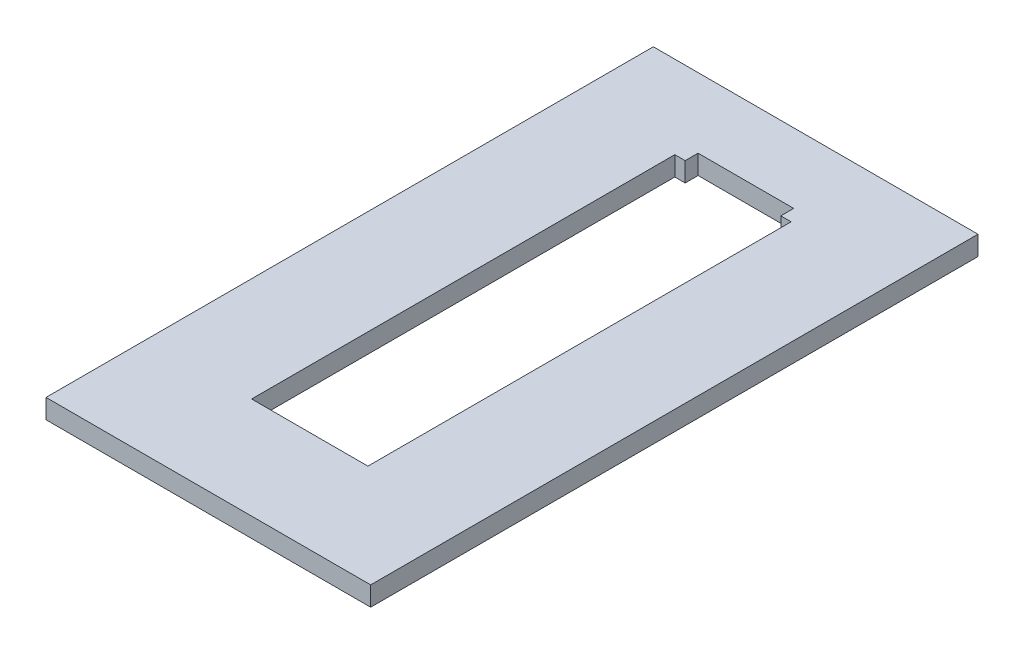
ISO-10303-21;
HEADER;
FILE_DESCRIPTION(('STEP AP214'),'2;1');
FILE_NAME('part.step','',(''),(''),'','','');
FILE_SCHEMA(('AUTOMOTIVE_DESIGN { 1 0 10303 214 1 1 1 1 }'));
ENDSEC;
DATA;
#1=APPLICATION_CONTEXT('core data for automotive mechanical design processes');
#2=APPLICATION_PROTOCOL_DEFINITION('international standard','automotive_design',2000,#1);
#3=PRODUCT_CONTEXT('',#1,'mechanical');
#4=PRODUCT('Part','Part','',(#3));
#5=PRODUCT_RELATED_PRODUCT_CATEGORY('part','',(#4));
#6=PRODUCT_DEFINITION_FORMATION('','',#4);
#7=PRODUCT_DEFINITION_CONTEXT('part definition',#1,'design');
#8=PRODUCT_DEFINITION('design','',#6,#7);
#9=PRODUCT_DEFINITION_SHAPE('','',#8);
#10=(LENGTH_UNIT() NAMED_UNIT(*) SI_UNIT(.MILLI.,.METRE.));
#11=(NAMED_UNIT(*) PLANE_ANGLE_UNIT() SI_UNIT($,.RADIAN.));
#12=(NAMED_UNIT(*) SI_UNIT($,.STERADIAN.) SOLID_ANGLE_UNIT());
#13=UNCERTAINTY_MEASURE_WITH_UNIT(LENGTH_MEASURE(1.E-05),#10,'distance_accuracy_value','');
#14=(GEOMETRIC_REPRESENTATION_CONTEXT(3) GLOBAL_UNCERTAINTY_ASSIGNED_CONTEXT((#13)) GLOBAL_UNIT_ASSIGNED_CONTEXT((#10,
#11,#12)) REPRESENTATION_CONTEXT('',''));
#15=CARTESIAN_POINT('',(0.,0.,0.));
#16=DIRECTION('',(0.,0.,1.));
#17=DIRECTION('',(1.,0.,0.));
#18=AXIS2_PLACEMENT_3D('',#15,#16,#17);
#19=CARTESIAN_POINT('',(-2512.49999999999,10958.8285003559,-4700.));
#20=DIRECTION('',(0.,0.,1.));
#21=DIRECTION('',(1.,0.,0.));
#22=AXIS2_PLACEMENT_3D('',#19,#20,#21);
#23=PLANE('',#22);
#24=DIRECTION('',(-1.,0.,0.));
#25=VECTOR('',#24,1.);
#26=CARTESIAN_POINT('',(-2512.49999999999,300.000000000001,-4700.));
#27=LINE('',#26,#25);
#28=CARTESIAN_POINT('',(2512.49999999999,300.000000000001,-4700.));
#29=VERTEX_POINT('',#28);
#30=CARTESIAN_POINT('',(-2512.49999999999,300.,-4700.));
#31=VERTEX_POINT('',#30);
#32=EDGE_CURVE('E11',#29,#31,#27,.T.);
#33=ORIENTED_EDGE('',*,*,#32,.F.);
#34=DIRECTION('',(0.,-1.,0.));
#35=VECTOR('',#34,1.);
#36=CARTESIAN_POINT('',(2512.49999999999,10958.8285003559,-4700.));
#37=LINE('',#36,#35);
#38=CARTESIAN_POINT('',(2512.49999999999,0.,-4700.));
#39=VERTEX_POINT('',#38);
#40=EDGE_CURVE('E215',#29,#39,#37,.T.);
#41=ORIENTED_EDGE('',*,*,#40,.T.);
#42=DIRECTION('',(-1.,0.,0.));
#43=VECTOR('',#42,1.);
#44=CARTESIAN_POINT('',(-2512.49999999999,0.,-4700.));
#45=LINE('',#44,#43);
#46=CARTESIAN_POINT('',(-2512.49999999999,0.,-4700.));
#47=VERTEX_POINT('',#46);
#48=EDGE_CURVE('E207',#39,#47,#45,.T.);
#49=ORIENTED_EDGE('',*,*,#48,.T.);
#50=DIRECTION('',(0.,-1.,0.));
#51=VECTOR('',#50,1.);
#52=CARTESIAN_POINT('',(-2512.49999999999,10958.8285003559,-4700.));
#53=LINE('',#52,#51);
#54=EDGE_CURVE('E211',#31,#47,#53,.T.);
#55=ORIENTED_EDGE('',*,*,#54,.F.);
#56=EDGE_LOOP('',(#33,#41,#49,#55));
#57=FACE_BOUND('',#56,.T.);
#58=ADVANCED_FACE('F36',(#57),#23,.F.);
#59=CARTESIAN_POINT('',(2512.49999999999,10958.8285003559,-4700.));
#60=DIRECTION('',(-1.,0.,0.));
#61=DIRECTION('',(0.,0.,1.));
#62=AXIS2_PLACEMENT_3D('',#59,#60,#61);
#63=PLANE('',#62);
#64=DIRECTION('',(0.,0.,-1.));
#65=VECTOR('',#64,1.);
#66=CARTESIAN_POINT('',(2512.49999999999,300.000000000001,-4700.));
#67=LINE('',#66,#65);
#68=CARTESIAN_POINT('',(2512.49999999999,300.,4700.));
#69=VERTEX_POINT('',#68);
#70=EDGE_CURVE('E89',#69,#29,#67,.T.);
#71=ORIENTED_EDGE('',*,*,#70,.F.);
#72=DIRECTION('',(0.,-1.,0.));
#73=VECTOR('',#72,1.);
#74=CARTESIAN_POINT('',(2512.49999999999,10958.8285003559,4700.));
#75=LINE('',#74,#73);
#76=CARTESIAN_POINT('',(2512.49999999999,0.,4700.));
#77=VERTEX_POINT('',#76);
#78=EDGE_CURVE('E219',#69,#77,#75,.T.);
#79=ORIENTED_EDGE('',*,*,#78,.T.);
#80=DIRECTION('',(0.,0.,-1.));
#81=VECTOR('',#80,1.);
#82=CARTESIAN_POINT('',(2512.49999999999,0.,-4700.));
#83=LINE('',#82,#81);
#84=EDGE_CURVE('E203',#77,#39,#83,.T.);
#85=ORIENTED_EDGE('',*,*,#84,.T.);
#86=ORIENTED_EDGE('',*,*,#40,.F.);
#87=EDGE_LOOP('',(#71,#79,#85,#86));
#88=FACE_BOUND('',#87,.T.);
#89=ADVANCED_FACE('F286',(#88),#63,.F.);
#90=CARTESIAN_POINT('',(-2512.49999999999,10958.8285003559,4700.));
#91=DIRECTION('',(0.,0.,-1.));
#92=DIRECTION('',(-1.,0.,0.));
#93=AXIS2_PLACEMENT_3D('',#90,#91,#92);
#94=PLANE('',#93);
#95=DIRECTION('',(1.,0.,0.));
#96=VECTOR('',#95,1.);
#97=CARTESIAN_POINT('',(-2512.49999999999,300.000000000001,4700.));
#98=LINE('',#97,#96);
#99=CARTESIAN_POINT('',(-2512.49999999999,300.,4700.));
#100=VERTEX_POINT('',#99);
#101=EDGE_CURVE('E61',#100,#69,#98,.T.);
#102=ORIENTED_EDGE('',*,*,#101,.F.);
#103=DIRECTION('',(0.,-1.,0.));
#104=VECTOR('',#103,1.);
#105=CARTESIAN_POINT('',(-2512.49999999999,10958.8285003559,4700.));
#106=LINE('',#105,#104);
#107=CARTESIAN_POINT('',(-2512.49999999999,0.,4700.));
#108=VERTEX_POINT('',#107);
#109=EDGE_CURVE('E223',#100,#108,#106,.T.);
#110=ORIENTED_EDGE('',*,*,#109,.T.);
#111=DIRECTION('',(1.,0.,0.));
#112=VECTOR('',#111,1.);
#113=CARTESIAN_POINT('',(-2512.49999999999,0.,4700.));
#114=LINE('',#113,#112);
#115=EDGE_CURVE('E199',#108,#77,#114,.T.);
#116=ORIENTED_EDGE('',*,*,#115,.T.);
#117=ORIENTED_EDGE('',*,*,#78,.F.);
#118=EDGE_LOOP('',(#102,#110,#116,#117));
#119=FACE_BOUND('',#118,.T.);
#120=ADVANCED_FACE('F292',(#119),#94,.F.);
#121=CARTESIAN_POINT('',(-2512.49999999999,10958.8285003559,-4700.));
#122=DIRECTION('',(1.,0.,0.));
#123=DIRECTION('',(0.,0.,-1.));
#124=AXIS2_PLACEMENT_3D('',#121,#122,#123);
#125=PLANE('',#124);
#126=DIRECTION('',(0.,0.,1.));
#127=VECTOR('',#126,1.);
#128=CARTESIAN_POINT('',(-2512.49999999999,300.000000000001,-4700.));
#129=LINE('',#128,#127);
#130=EDGE_CURVE('E40',#31,#100,#129,.T.);
#131=ORIENTED_EDGE('',*,*,#130,.F.);
#132=ORIENTED_EDGE('',*,*,#54,.T.);
#133=DIRECTION('',(0.,0.,1.));
#134=VECTOR('',#133,1.);
#135=CARTESIAN_POINT('',(-2512.49999999999,0.,-4700.));
#136=LINE('',#135,#134);
#137=EDGE_CURVE('E195',#47,#108,#136,.T.);
#138=ORIENTED_EDGE('',*,*,#137,.T.);
#139=ORIENTED_EDGE('',*,*,#109,.F.);
#140=EDGE_LOOP('',(#131,#132,#138,#139));
#141=FACE_BOUND('',#140,.T.);
#142=ADVANCED_FACE('F38',(#141),#125,.F.);
#143=CARTESIAN_POINT('',(0.,0.,0.));
#144=DIRECTION('',(0.,1.,0.));
#145=DIRECTION('',(0.,0.,1.));
#146=AXIS2_PLACEMENT_3D('',#143,#144,#145);
#147=PLANE('',#146);
#148=ORIENTED_EDGE('',*,*,#137,.F.);
#149=ORIENTED_EDGE('',*,*,#48,.F.);
#150=ORIENTED_EDGE('',*,*,#84,.F.);
#151=ORIENTED_EDGE('',*,*,#115,.F.);
#152=EDGE_LOOP('',(#148,#149,#150,#151));
#153=FACE_BOUND('',#152,.T.);
#154=DIRECTION('',(0.,0.,-1.));
#155=VECTOR('',#154,1.);
#156=CARTESIAN_POINT('',(899.999999999976,0.,3130.00000000009));
#157=LINE('',#156,#155);
#158=CARTESIAN_POINT('',(899.999999999976,0.,3130.00000000009));
#159=VERTEX_POINT('',#158);
#160=CARTESIAN_POINT('',(900.000000000223,0.,-3420.00000000002));
#161=VERTEX_POINT('',#160);
#162=EDGE_CURVE('E142',#159,#161,#157,.T.);
#163=ORIENTED_EDGE('',*,*,#162,.T.);
#164=DIRECTION('',(-1.,0.,0.));
#165=VECTOR('',#164,1.);
#166=CARTESIAN_POINT('',(739.999999999991,0.,-3420.00000000002));
#167=LINE('',#166,#165);
#168=CARTESIAN_POINT('',(739.999999999991,0.,-3420.00000000002));
#169=VERTEX_POINT('',#168);
#170=EDGE_CURVE('E146',#161,#169,#167,.T.);
#171=ORIENTED_EDGE('',*,*,#170,.T.);
#172=DIRECTION('',(0.,0.,-1.));
#173=VECTOR('',#172,1.);
#174=CARTESIAN_POINT('',(739.999999999991,0.,-3420.00000000002));
#175=LINE('',#174,#173);
#176=CARTESIAN_POINT('',(739.999999999991,0.,-3620.00000000002));
#177=VERTEX_POINT('',#176);
#178=EDGE_CURVE('E150',#169,#177,#175,.T.);
#179=ORIENTED_EDGE('',*,*,#178,.T.);
#180=DIRECTION('',(-1.,0.,0.));
#181=VECTOR('',#180,1.);
#182=CARTESIAN_POINT('',(739.999999999991,0.,-3620.00000000002));
#183=LINE('',#182,#181);
#184=CARTESIAN_POINT('',(-740.000000000009,0.,-3620.00000000002));
#185=VERTEX_POINT('',#184);
#186=EDGE_CURVE('E154',#177,#185,#183,.T.);
#187=ORIENTED_EDGE('',*,*,#186,.T.);
#188=DIRECTION('',(0.,0.,1.));
#189=VECTOR('',#188,1.);
#190=CARTESIAN_POINT('',(-740.000000000009,0.,-3420.00000000002));
#191=LINE('',#190,#189);
#192=CARTESIAN_POINT('',(-740.000000000009,0.,-3420.00000000002));
#193=VERTEX_POINT('',#192);
#194=EDGE_CURVE('E117',#185,#193,#191,.T.);
#195=ORIENTED_EDGE('',*,*,#194,.T.);
#196=DIRECTION('',(-1.,0.,-4.35762537166002E-13));
#197=VECTOR('',#196,1.);
#198=CARTESIAN_POINT('',(-740.000000000009,0.,-3420.00000000002));
#199=LINE('',#198,#197);
#200=CARTESIAN_POINT('',(-899.999999999778,0.,-3420.00000000009));
#201=VERTEX_POINT('',#200);
#202=EDGE_CURVE('E159',#193,#201,#199,.T.);
#203=ORIENTED_EDGE('',*,*,#202,.T.);
#204=DIRECTION('',(0.,0.,1.));
#205=VECTOR('',#204,1.);
#206=CARTESIAN_POINT('',(-899.999999999778,0.,3130.00000000009));
#207=LINE('',#206,#205);
#208=CARTESIAN_POINT('',(-899.999999999778,0.,3130.00000000009));
#209=VERTEX_POINT('',#208);
#210=EDGE_CURVE('E163',#201,#209,#207,.T.);
#211=ORIENTED_EDGE('',*,*,#210,.T.);
#212=DIRECTION('',(1.,0.,0.));
#213=VECTOR('',#212,1.);
#214=CARTESIAN_POINT('',(899.999999999976,0.,3130.00000000009));
#215=LINE('',#214,#213);
#216=EDGE_CURVE('E167',#209,#159,#215,.T.);
#217=ORIENTED_EDGE('',*,*,#216,.T.);
#218=EDGE_LOOP('',(#163,#171,#179,#187,#195,#203,#211,#217));
#219=FACE_BOUND('',#218,.T.);
#220=ADVANCED_FACE('F274',(#153,#219),#147,.F.);
#221=CARTESIAN_POINT('',(899.999999999976,10958.8285003559,3130.00000000009));
#222=DIRECTION('',(0.,0.,-1.));
#223=DIRECTION('',(-1.,0.,0.));
#224=AXIS2_PLACEMENT_3D('',#221,#222,#223);
#225=PLANE('',#224);
#226=DIRECTION('',(0.,-1.,0.));
#227=VECTOR('',#226,1.);
#228=CARTESIAN_POINT('',(-899.999999999778,10958.8285003559,3130.00000000009));
#229=LINE('',#228,#227);
#230=CARTESIAN_POINT('',(-899.999999999778,300.000000000001,3130.00000000009));
#231=VERTEX_POINT('',#230);
#232=EDGE_CURVE('E175',#231,#209,#229,.T.);
#233=ORIENTED_EDGE('',*,*,#232,.F.);
#234=DIRECTION('',(1.,0.,0.));
#235=VECTOR('',#234,1.);
#236=CARTESIAN_POINT('',(899.999999999976,300.000000000001,3130.00000000009));
#237=LINE('',#236,#235);
#238=CARTESIAN_POINT('',(899.999999999976,300.000000000001,3130.00000000009));
#239=VERTEX_POINT('',#238);
#240=EDGE_CURVE('E86',#231,#239,#237,.T.);
#241=ORIENTED_EDGE('',*,*,#240,.T.);
#242=DIRECTION('',(0.,-1.,0.));
#243=VECTOR('',#242,1.);
#244=CARTESIAN_POINT('',(899.999999999976,10958.8285003559,3130.00000000009));
#245=LINE('',#244,#243);
#246=EDGE_CURVE('E171',#239,#159,#245,.T.);
#247=ORIENTED_EDGE('',*,*,#246,.T.);
#248=ORIENTED_EDGE('',*,*,#216,.F.);
#249=EDGE_LOOP('',(#233,#241,#247,#248));
#250=FACE_BOUND('',#249,.T.);
#251=ADVANCED_FACE('F268',(#250),#225,.T.);
#252=CARTESIAN_POINT('',(-899.999999999778,10958.8285003559,3130.00000000009));
#253=DIRECTION('',(1.,0.,0.));
#254=DIRECTION('',(0.,0.,-1.));
#255=AXIS2_PLACEMENT_3D('',#252,#253,#254);
#256=PLANE('',#255);
#257=DIRECTION('',(0.,-1.,0.));
#258=VECTOR('',#257,1.);
#259=CARTESIAN_POINT('',(-899.999999999778,10958.8285003559,-3420.00000000009));
#260=LINE('',#259,#258);
#261=CARTESIAN_POINT('',(-899.999999999778,300.000000000001,-3420.00000000009));
#262=VERTEX_POINT('',#261);
#263=EDGE_CURVE('E179',#262,#201,#260,.T.);
#264=ORIENTED_EDGE('',*,*,#263,.F.);
#265=DIRECTION('',(0.,0.,1.));
#266=VECTOR('',#265,1.);
#267=CARTESIAN_POINT('',(-899.999999999778,300.000000000001,3130.00000000009));
#268=LINE('',#267,#266);
#269=EDGE_CURVE('E47',#262,#231,#268,.T.);
#270=ORIENTED_EDGE('',*,*,#269,.T.);
#271=ORIENTED_EDGE('',*,*,#232,.T.);
#272=ORIENTED_EDGE('',*,*,#210,.F.);
#273=EDGE_LOOP('',(#264,#270,#271,#272));
#274=FACE_BOUND('',#273,.T.);
#275=ADVANCED_FACE('F276',(#274),#256,.T.);
#276=CARTESIAN_POINT('',(-740.000000000009,10958.8285003559,-3420.00000000002));
#277=DIRECTION('',(-4.35762537166002E-13,0.,1.));
#278=DIRECTION('',(1.,0.,4.35762537166002E-13));
#279=AXIS2_PLACEMENT_3D('',#276,#277,#278);
#280=PLANE('',#279);
#281=DIRECTION('',(0.,-1.,0.));
#282=VECTOR('',#281,1.);
#283=CARTESIAN_POINT('',(-740.000000000009,10958.8285003559,-3420.00000000002));
#284=LINE('',#283,#282);
#285=CARTESIAN_POINT('',(-740.000000000009,300.000000000001,-3420.00000000002));
#286=VERTEX_POINT('',#285);
#287=EDGE_CURVE('E123',#286,#193,#284,.T.);
#288=ORIENTED_EDGE('',*,*,#287,.F.);
#289=DIRECTION('',(-1.,0.,-4.35762537166002E-13));
#290=VECTOR('',#289,1.);
#291=CARTESIAN_POINT('',(-740.000000000009,300.000000000001,-3420.00000000002));
#292=LINE('',#291,#290);
#293=EDGE_CURVE('E105',#286,#262,#292,.T.);
#294=ORIENTED_EDGE('',*,*,#293,.T.);
#295=ORIENTED_EDGE('',*,*,#263,.T.);
#296=ORIENTED_EDGE('',*,*,#202,.F.);
#297=EDGE_LOOP('',(#288,#294,#295,#296));
#298=FACE_BOUND('',#297,.T.);
#299=ADVANCED_FACE('F243',(#298),#280,.T.);
#300=CARTESIAN_POINT('',(-740.000000000009,10958.8285003559,-3420.00000000002));
#301=DIRECTION('',(1.,0.,0.));
#302=DIRECTION('',(0.,0.,-1.));
#303=AXIS2_PLACEMENT_3D('',#300,#301,#302);
#304=PLANE('',#303);
#305=DIRECTION('',(0.,-1.,0.));
#306=VECTOR('',#305,1.);
#307=CARTESIAN_POINT('',(-740.000000000009,10958.8285003559,-3620.00000000002));
#308=LINE('',#307,#306);
#309=CARTESIAN_POINT('',(-740.000000000009,300.000000000001,-3620.00000000002));
#310=VERTEX_POINT('',#309);
#311=EDGE_CURVE('E113',#310,#185,#308,.T.);
#312=ORIENTED_EDGE('',*,*,#311,.F.);
#313=DIRECTION('',(0.,0.,1.));
#314=VECTOR('',#313,1.);
#315=CARTESIAN_POINT('',(-740.000000000009,300.000000000001,-3420.00000000002));
#316=LINE('',#315,#314);
#317=EDGE_CURVE('E98',#310,#286,#316,.T.);
#318=ORIENTED_EDGE('',*,*,#317,.T.);
#319=ORIENTED_EDGE('',*,*,#287,.T.);
#320=ORIENTED_EDGE('',*,*,#194,.F.);
#321=EDGE_LOOP('',(#312,#318,#319,#320));
#322=FACE_BOUND('',#321,.T.);
#323=ADVANCED_FACE('F114',(#322),#304,.T.);
#324=CARTESIAN_POINT('',(739.999999999991,10958.8285003559,-3620.00000000002));
#325=DIRECTION('',(0.,0.,1.));
#326=DIRECTION('',(1.,0.,0.));
#327=AXIS2_PLACEMENT_3D('',#324,#325,#326);
#328=PLANE('',#327);
#329=DIRECTION('',(0.,-1.,0.));
#330=VECTOR('',#329,1.);
#331=CARTESIAN_POINT('',(739.999999999991,10958.8285003559,-3620.00000000002));
#332=LINE('',#331,#330);
#333=CARTESIAN_POINT('',(739.999999999991,300.000000000001,-3620.00000000002));
#334=VERTEX_POINT('',#333);
#335=EDGE_CURVE('E122',#334,#177,#332,.T.);
#336=ORIENTED_EDGE('',*,*,#335,.F.);
#337=DIRECTION('',(-1.,0.,0.));
#338=VECTOR('',#337,1.);
#339=CARTESIAN_POINT('',(739.999999999991,300.000000000001,-3620.00000000002));
#340=LINE('',#339,#338);
#341=EDGE_CURVE('E102',#334,#310,#340,.T.);
#342=ORIENTED_EDGE('',*,*,#341,.T.);
#343=ORIENTED_EDGE('',*,*,#311,.T.);
#344=ORIENTED_EDGE('',*,*,#186,.F.);
#345=EDGE_LOOP('',(#336,#342,#343,#344));
#346=FACE_BOUND('',#345,.T.);
#347=ADVANCED_FACE('F125',(#346),#328,.T.);
#348=CARTESIAN_POINT('',(739.999999999991,10958.8285003559,-3420.00000000002));
#349=DIRECTION('',(-1.,0.,0.));
#350=DIRECTION('',(0.,0.,1.));
#351=AXIS2_PLACEMENT_3D('',#348,#349,#350);
#352=PLANE('',#351);
#353=DIRECTION('',(0.,-1.,0.));
#354=VECTOR('',#353,1.);
#355=CARTESIAN_POINT('',(739.999999999991,10958.8285003559,-3420.00000000002));
#356=LINE('',#355,#354);
#357=CARTESIAN_POINT('',(739.999999999991,300.000000000001,-3420.00000000002));
#358=VERTEX_POINT('',#357);
#359=EDGE_CURVE('E187',#358,#169,#356,.T.);
#360=ORIENTED_EDGE('',*,*,#359,.F.);
#361=DIRECTION('',(0.,0.,-1.));
#362=VECTOR('',#361,1.);
#363=CARTESIAN_POINT('',(739.999999999991,300.000000000001,-3420.00000000002));
#364=LINE('',#363,#362);
#365=EDGE_CURVE('E129',#358,#334,#364,.T.);
#366=ORIENTED_EDGE('',*,*,#365,.T.);
#367=ORIENTED_EDGE('',*,*,#335,.T.);
#368=ORIENTED_EDGE('',*,*,#178,.F.);
#369=EDGE_LOOP('',(#360,#366,#367,#368));
#370=FACE_BOUND('',#369,.T.);
#371=ADVANCED_FACE('F321',(#370),#352,.T.);
#372=CARTESIAN_POINT('',(739.999999999991,10958.8285003559,-3420.00000000002));
#373=DIRECTION('',(0.,0.,1.));
#374=DIRECTION('',(1.,0.,0.));
#375=AXIS2_PLACEMENT_3D('',#372,#373,#374);
#376=PLANE('',#375);
#377=DIRECTION('',(0.,-1.,0.));
#378=VECTOR('',#377,1.);
#379=CARTESIAN_POINT('',(900.000000000223,10958.8285003559,-3420.00000000002));
#380=LINE('',#379,#378);
#381=CARTESIAN_POINT('',(900.000000000223,300.000000000001,-3420.00000000002));
#382=VERTEX_POINT('',#381);
#383=EDGE_CURVE('E191',#382,#161,#380,.T.);
#384=ORIENTED_EDGE('',*,*,#383,.F.);
#385=DIRECTION('',(-1.,0.,0.));
#386=VECTOR('',#385,1.);
#387=CARTESIAN_POINT('',(739.999999999991,300.000000000001,-3420.00000000002));
#388=LINE('',#387,#386);
#389=EDGE_CURVE('E70',#382,#358,#388,.T.);
#390=ORIENTED_EDGE('',*,*,#389,.T.);
#391=ORIENTED_EDGE('',*,*,#359,.T.);
#392=ORIENTED_EDGE('',*,*,#170,.F.);
#393=EDGE_LOOP('',(#384,#390,#391,#392));
#394=FACE_BOUND('',#393,.T.);
#395=ADVANCED_FACE('F317',(#394),#376,.T.);
#396=CARTESIAN_POINT('',(899.999999999976,10958.8285003559,3130.00000000009));
#397=DIRECTION('',(-1.,0.,0.));
#398=DIRECTION('',(0.,0.,1.));
#399=AXIS2_PLACEMENT_3D('',#396,#397,#398);
#400=PLANE('',#399);
#401=ORIENTED_EDGE('',*,*,#246,.F.);
#402=DIRECTION('',(0.,0.,-1.));
#403=VECTOR('',#402,1.);
#404=CARTESIAN_POINT('',(899.999999999976,300.000000000001,3130.00000000009));
#405=LINE('',#404,#403);
#406=EDGE_CURVE('E138',#239,#382,#405,.T.);
#407=ORIENTED_EDGE('',*,*,#406,.T.);
#408=ORIENTED_EDGE('',*,*,#383,.T.);
#409=ORIENTED_EDGE('',*,*,#162,.F.);
#410=EDGE_LOOP('',(#401,#407,#408,#409));
#411=FACE_BOUND('',#410,.T.);
#412=ADVANCED_FACE('F270',(#411),#400,.T.);
#413=CARTESIAN_POINT('',(-7.54951656745106E-12,300.,-1.77635683940025E-12));
#414=DIRECTION('',(0.,1.,0.));
#415=DIRECTION('',(0.,0.,1.));
#416=AXIS2_PLACEMENT_3D('',#413,#414,#415);
#417=PLANE('',#416);
#418=ORIENTED_EDGE('',*,*,#240,.F.);
#419=ORIENTED_EDGE('',*,*,#269,.F.);
#420=ORIENTED_EDGE('',*,*,#293,.F.);
#421=ORIENTED_EDGE('',*,*,#317,.F.);
#422=ORIENTED_EDGE('',*,*,#341,.F.);
#423=ORIENTED_EDGE('',*,*,#365,.F.);
#424=ORIENTED_EDGE('',*,*,#389,.F.);
#425=ORIENTED_EDGE('',*,*,#406,.F.);
#426=EDGE_LOOP('',(#418,#419,#420,#421,#422,#423,#424,#425));
#427=FACE_BOUND('',#426,.T.);
#428=ORIENTED_EDGE('',*,*,#130,.T.);
#429=ORIENTED_EDGE('',*,*,#101,.T.);
#430=ORIENTED_EDGE('',*,*,#70,.T.);
#431=ORIENTED_EDGE('',*,*,#32,.T.);
#432=EDGE_LOOP('',(#428,#429,#430,#431));
#433=FACE_BOUND('',#432,.T.);
#434=ADVANCED_FACE('F100',(#427,#433),#417,.T.);
#435=CLOSED_SHELL('',(#58,#89,#120,#142,#220,#251,#275,#299,#323,#347,#371,#395,#412,#434));
#436=MANIFOLD_SOLID_BREP('B2',#435);
#437=ADVANCED_BREP_SHAPE_REPRESENTATION('',(#18,#436),#14);
#438=SHAPE_DEFINITION_REPRESENTATION(#9,#437);
ENDSEC;
END-ISO-10303-21;
